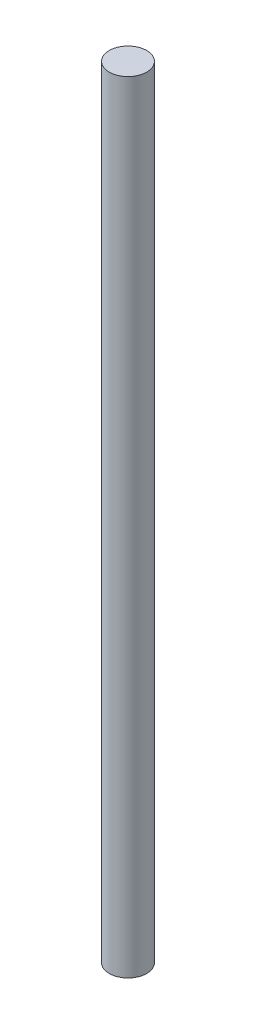
ISO-10303-21;
HEADER;
FILE_DESCRIPTION(('STEP AP214'),'2;1');
FILE_NAME('part.step','',(''),(''),'','','');
FILE_SCHEMA(('AUTOMOTIVE_DESIGN { 1 0 10303 214 1 1 1 1 }'));
ENDSEC;
DATA;
#1=APPLICATION_CONTEXT('core data for automotive mechanical design processes');
#2=APPLICATION_PROTOCOL_DEFINITION('international standard','automotive_design',2000,#1);
#3=PRODUCT_CONTEXT('',#1,'mechanical');
#4=PRODUCT('Part','Part','',(#3));
#5=PRODUCT_RELATED_PRODUCT_CATEGORY('part','',(#4));
#6=PRODUCT_DEFINITION_FORMATION('','',#4);
#7=PRODUCT_DEFINITION_CONTEXT('part definition',#1,'design');
#8=PRODUCT_DEFINITION('design','',#6,#7);
#9=PRODUCT_DEFINITION_SHAPE('','',#8);
#10=(LENGTH_UNIT() NAMED_UNIT(*) SI_UNIT(.MILLI.,.METRE.));
#11=(NAMED_UNIT(*) PLANE_ANGLE_UNIT() SI_UNIT($,.RADIAN.));
#12=(NAMED_UNIT(*) SI_UNIT($,.STERADIAN.) SOLID_ANGLE_UNIT());
#13=UNCERTAINTY_MEASURE_WITH_UNIT(LENGTH_MEASURE(1.E-05),#10,'distance_accuracy_value','');
#14=(GEOMETRIC_REPRESENTATION_CONTEXT(3) GLOBAL_UNCERTAINTY_ASSIGNED_CONTEXT((#13)) GLOBAL_UNIT_ASSIGNED_CONTEXT((#10,
#11,#12)) REPRESENTATION_CONTEXT('',''));
#15=CARTESIAN_POINT('',(0.,0.,0.));
#16=DIRECTION('',(0.,0.,1.));
#17=DIRECTION('',(1.,0.,0.));
#18=AXIS2_PLACEMENT_3D('',#15,#16,#17);
#19=CARTESIAN_POINT('',(0.,9900.,0.));
#20=DIRECTION('',(0.,-1.,0.));
#21=DIRECTION('',(0.,0.,-1.));
#22=AXIS2_PLACEMENT_3D('',#19,#20,#21);
#23=CYLINDRICAL_SURFACE('',#22,237.5);
#24=CARTESIAN_POINT('',(0.,9900.,0.));
#25=DIRECTION('',(0.,1.,0.));
#26=DIRECTION('',(0.,0.,1.));
#27=AXIS2_PLACEMENT_3D('',#24,#25,#26);
#28=CIRCLE('',#27,237.5);
#29=CARTESIAN_POINT('',(0.,9900.,237.5));
#30=VERTEX_POINT('',#29);
#31=EDGE_CURVE('E10',#30,#30,#28,.T.);
#32=ORIENTED_EDGE('',*,*,#31,.F.);
#33=EDGE_LOOP('',(#32));
#34=FACE_BOUND('',#33,.T.);
#35=CARTESIAN_POINT('',(0.,0.,0.));
#36=DIRECTION('',(0.,1.,0.));
#37=DIRECTION('',(0.,0.,1.));
#38=AXIS2_PLACEMENT_3D('',#35,#36,#37);
#39=CIRCLE('',#38,237.5);
#40=CARTESIAN_POINT('',(0.,0.,237.5));
#41=VERTEX_POINT('',#40);
#42=EDGE_CURVE('E34',#41,#41,#39,.T.);
#43=ORIENTED_EDGE('',*,*,#42,.T.);
#44=EDGE_LOOP('',(#43));
#45=FACE_BOUND('',#44,.T.);
#46=ADVANCED_FACE('F31',(#34,#45),#23,.T.);
#47=CARTESIAN_POINT('',(0.,9900.,0.));
#48=DIRECTION('',(0.,1.,0.));
#49=DIRECTION('',(0.,0.,1.));
#50=AXIS2_PLACEMENT_3D('',#47,#48,#49);
#51=PLANE('',#50);
#52=ORIENTED_EDGE('',*,*,#31,.T.);
#53=EDGE_LOOP('',(#52));
#54=FACE_BOUND('',#53,.T.);
#55=ADVANCED_FACE('F46',(#54),#51,.T.);
#56=CARTESIAN_POINT('',(0.,0.,0.));
#57=DIRECTION('',(0.,1.,0.));
#58=DIRECTION('',(0.,0.,1.));
#59=AXIS2_PLACEMENT_3D('',#56,#57,#58);
#60=PLANE('',#59);
#61=ORIENTED_EDGE('',*,*,#42,.F.);
#62=EDGE_LOOP('',(#61));
#63=FACE_BOUND('',#62,.T.);
#64=ADVANCED_FACE('F44',(#63),#60,.F.);
#65=CLOSED_SHELL('',(#46,#55,#64));
#66=MANIFOLD_SOLID_BREP('B2',#65);
#67=ADVANCED_BREP_SHAPE_REPRESENTATION('',(#18,#66),#14);
#68=SHAPE_DEFINITION_REPRESENTATION(#9,#67);
ENDSEC;
END-ISO-10303-21;
